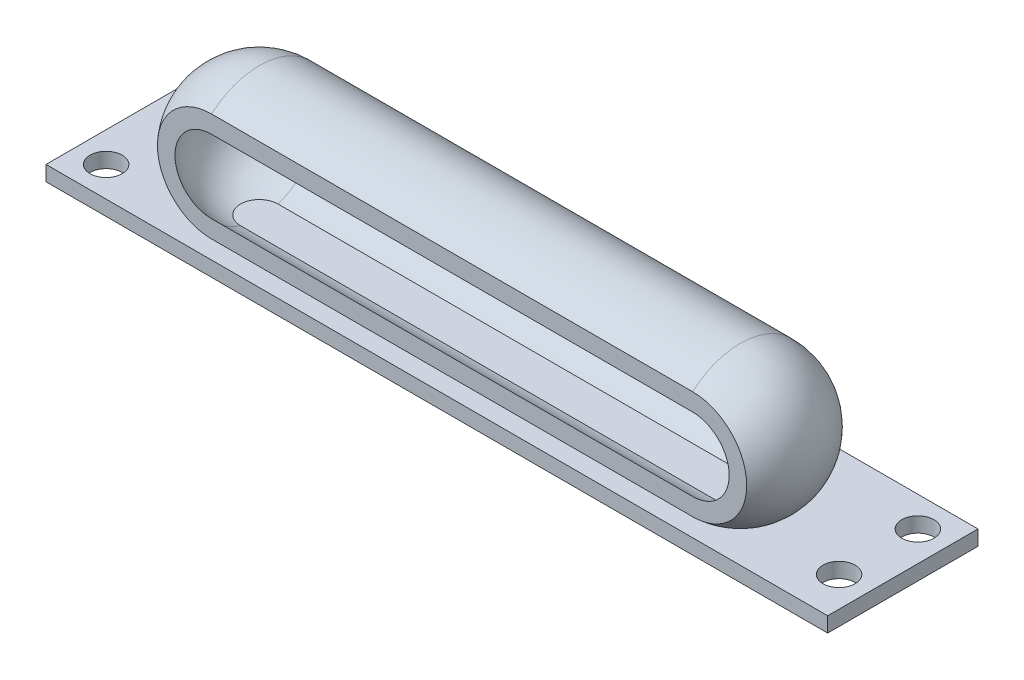
ISO-10303-21;
HEADER;
FILE_DESCRIPTION(('STEP AP214'),'2;1');
FILE_NAME('part.step','',(''),(''),'','','');
FILE_SCHEMA(('AUTOMOTIVE_DESIGN { 1 0 10303 214 1 1 1 1 }'));
ENDSEC;
DATA;
#1=APPLICATION_CONTEXT('core data for automotive mechanical design processes');
#2=APPLICATION_PROTOCOL_DEFINITION('international standard','automotive_design',2000,#1);
#3=PRODUCT_CONTEXT('',#1,'mechanical');
#4=PRODUCT('Part','Part','',(#3));
#5=PRODUCT_RELATED_PRODUCT_CATEGORY('part','',(#4));
#6=PRODUCT_DEFINITION_FORMATION('','',#4);
#7=PRODUCT_DEFINITION_CONTEXT('part definition',#1,'design');
#8=PRODUCT_DEFINITION('design','',#6,#7);
#9=PRODUCT_DEFINITION_SHAPE('','',#8);
#10=(LENGTH_UNIT() NAMED_UNIT(*) SI_UNIT(.MILLI.,.METRE.));
#11=(NAMED_UNIT(*) PLANE_ANGLE_UNIT() SI_UNIT($,.RADIAN.));
#12=(NAMED_UNIT(*) SI_UNIT($,.STERADIAN.) SOLID_ANGLE_UNIT());
#13=UNCERTAINTY_MEASURE_WITH_UNIT(LENGTH_MEASURE(1.E-05),#10,'distance_accuracy_value','');
#14=(GEOMETRIC_REPRESENTATION_CONTEXT(3) GLOBAL_UNCERTAINTY_ASSIGNED_CONTEXT((#13)) GLOBAL_UNIT_ASSIGNED_CONTEXT((#10,
#11,#12)) REPRESENTATION_CONTEXT('',''));
#15=CARTESIAN_POINT('',(0.,0.,0.));
#16=DIRECTION('',(0.,0.,1.));
#17=DIRECTION('',(1.,0.,0.));
#18=AXIS2_PLACEMENT_3D('',#15,#16,#17);
#19=CARTESIAN_POINT('',(0.,0.,0.));
#20=DIRECTION('',(-1.,0.,0.));
#21=DIRECTION('',(0.,0.,1.));
#22=AXIS2_PLACEMENT_3D('',#19,#20,#21);
#23=CYLINDRICAL_SURFACE('',#22,7.62);
#24=CARTESIAN_POINT('',(0.,0.,0.));
#25=DIRECTION('',(-1.,0.,0.));
#26=DIRECTION('',(0.,0.,1.));
#27=AXIS2_PLACEMENT_3D('',#24,#25,#26);
#28=CIRCLE('',#27,7.62);
#29=CARTESIAN_POINT('',(0.,-6.0325,4.65546385981032));
#30=VERTEX_POINT('',#29);
#31=CARTESIAN_POINT('',(0.,-5.715,5.04015624757805));
#32=VERTEX_POINT('',#31);
#33=EDGE_CURVE('E191',#30,#32,#28,.T.);
#34=ORIENTED_EDGE('',*,*,#33,.F.);
#35=DIRECTION('',(-1.,0.,0.));
#36=VECTOR('',#35,1.);
#37=CARTESIAN_POINT('',(0.,-6.0325,4.65546385981032));
#38=LINE('',#37,#36);
#39=CARTESIAN_POINT('',(50.8,-6.0325,4.65546385981032));
#40=VERTEX_POINT('',#39);
#41=EDGE_CURVE('E158',#30,#40,#38,.F.);
#42=ORIENTED_EDGE('',*,*,#41,.T.);
#43=CARTESIAN_POINT('',(50.8,0.,0.));
#44=DIRECTION('',(-1.,0.,0.));
#45=DIRECTION('',(0.,0.,1.));
#46=AXIS2_PLACEMENT_3D('',#43,#44,#45);
#47=CIRCLE('',#46,7.62);
#48=CARTESIAN_POINT('',(50.7999999999999,-5.715,5.04015624757804));
#49=VERTEX_POINT('',#48);
#50=EDGE_CURVE('E195',#40,#49,#47,.T.);
#51=ORIENTED_EDGE('',*,*,#50,.T.);
#52=DIRECTION('',(-1.,0.,0.));
#53=VECTOR('',#52,1.);
#54=CARTESIAN_POINT('',(0.,-5.715,5.04015624757805));
#55=LINE('',#54,#53);
#56=EDGE_CURVE('E199',#49,#32,#55,.T.);
#57=ORIENTED_EDGE('',*,*,#56,.T.);
#58=EDGE_LOOP('',(#34,#42,#51,#57));
#59=FACE_BOUND('',#58,.T.);
#60=ADVANCED_FACE('F33',(#59),#23,.T.);
#61=CARTESIAN_POINT('',(0.,0.,0.));
#62=DIRECTION('',(-1.,0.,0.));
#63=DIRECTION('',(0.,0.,1.));
#64=AXIS2_PLACEMENT_3D('',#61,#62,#63);
#65=CYLINDRICAL_SURFACE('',#64,6.35);
#66=DIRECTION('',(-1.,0.,0.));
#67=VECTOR('',#66,1.);
#68=CARTESIAN_POINT('',(0.,-6.0325,-1.98278686449149));
#69=LINE('',#68,#67);
#70=CARTESIAN_POINT('',(50.7999999999999,-6.0325,-1.98278686449149));
#71=VERTEX_POINT('',#70);
#72=CARTESIAN_POINT('',(0.,-6.0325,-1.98278686449149));
#73=VERTEX_POINT('',#72);
#74=EDGE_CURVE('E11',#71,#73,#69,.T.);
#75=ORIENTED_EDGE('',*,*,#74,.F.);
#76=CARTESIAN_POINT('',(50.7999999999999,0.,0.));
#77=DIRECTION('',(-1.,0.,0.));
#78=DIRECTION('',(0.,0.,1.));
#79=AXIS2_PLACEMENT_3D('',#76,#77,#78);
#80=CIRCLE('',#79,6.35);
#81=CARTESIAN_POINT('',(50.7999999999999,3.86255420673937,5.04015624757804));
#82=VERTEX_POINT('',#81);
#83=EDGE_CURVE('E172',#82,#71,#80,.T.);
#84=ORIENTED_EDGE('',*,*,#83,.F.);
#85=DIRECTION('',(-1.,0.,0.));
#86=VECTOR('',#85,1.);
#87=CARTESIAN_POINT('',(0.,3.86255420673937,5.04015624757804));
#88=LINE('',#87,#86);
#89=CARTESIAN_POINT('',(0.,3.86255420673937,5.04015624757804));
#90=VERTEX_POINT('',#89);
#91=EDGE_CURVE('E180',#90,#82,#88,.F.);
#92=ORIENTED_EDGE('',*,*,#91,.F.);
#93=CARTESIAN_POINT('',(0.,0.,0.));
#94=DIRECTION('',(-1.,0.,0.));
#95=DIRECTION('',(0.,0.,1.));
#96=AXIS2_PLACEMENT_3D('',#93,#94,#95);
#97=CIRCLE('',#96,6.35);
#98=EDGE_CURVE('E168',#90,#73,#97,.T.);
#99=ORIENTED_EDGE('',*,*,#98,.T.);
#100=EDGE_LOOP('',(#75,#84,#92,#99));
#101=FACE_BOUND('',#100,.T.);
#102=ADVANCED_FACE('F221',(#101),#65,.F.);
#103=CARTESIAN_POINT('',(0.,0.,0.));
#104=DIRECTION('',(-1.,0.,0.));
#105=DIRECTION('',(0.,1.,0.));
#106=AXIS2_PLACEMENT_3D('',#103,#104,#105);
#107=SPHERICAL_SURFACE('',#106,7.62);
#108=CARTESIAN_POINT('',(0.,5.715,5.04015624757804));
#109=VERTEX_POINT('',#108);
#110=CARTESIAN_POINT('',(0.,-6.0325,-4.65546385981032));
#111=VERTEX_POINT('',#110);
#112=EDGE_CURVE('E192',#109,#111,#28,.T.);
#113=ORIENTED_EDGE('',*,*,#112,.T.);
#114=CARTESIAN_POINT('',(0.,-6.0325,0.));
#115=DIRECTION('',(0.,1.,0.));
#116=DIRECTION('',(0.,0.,1.));
#117=AXIS2_PLACEMENT_3D('',#114,#115,#116);
#118=CIRCLE('',#117,4.65546385981032);
#119=EDGE_CURVE('E161',#111,#30,#118,.T.);
#120=ORIENTED_EDGE('',*,*,#119,.T.);
#121=ORIENTED_EDGE('',*,*,#33,.T.);
#122=CARTESIAN_POINT('',(0.,0.,5.04015624757804));
#123=DIRECTION('',(0.,0.,-1.));
#124=DIRECTION('',(-1.,0.,0.));
#125=AXIS2_PLACEMENT_3D('',#122,#123,#124);
#126=CIRCLE('',#125,5.715);
#127=EDGE_CURVE('E188',#32,#109,#126,.T.);
#128=ORIENTED_EDGE('',*,*,#127,.T.);
#129=EDGE_LOOP('',(#113,#120,#121,#128));
#130=FACE_BOUND('',#129,.T.);
#131=ADVANCED_FACE('F35',(#130),#107,.T.);
#132=CARTESIAN_POINT('',(50.8,0.,0.));
#133=DIRECTION('',(-1.,0.,0.));
#134=DIRECTION('',(0.,1.,0.));
#135=AXIS2_PLACEMENT_3D('',#132,#133,#134);
#136=SPHERICAL_SURFACE('',#135,7.62);
#137=ORIENTED_EDGE('',*,*,#50,.F.);
#138=CARTESIAN_POINT('',(50.8,-6.0325,0.));
#139=DIRECTION('',(0.,1.,0.));
#140=DIRECTION('',(0.,0.,1.));
#141=AXIS2_PLACEMENT_3D('',#138,#139,#140);
#142=CIRCLE('',#141,4.65546385981032);
#143=CARTESIAN_POINT('',(50.8,-6.0325,-4.65546385981032));
#144=VERTEX_POINT('',#143);
#145=EDGE_CURVE('E48',#40,#144,#142,.T.);
#146=ORIENTED_EDGE('',*,*,#145,.T.);
#147=CARTESIAN_POINT('',(50.7999999999999,5.715,5.04015624757804));
#148=VERTEX_POINT('',#147);
#149=EDGE_CURVE('E196',#148,#144,#47,.T.);
#150=ORIENTED_EDGE('',*,*,#149,.F.);
#151=CARTESIAN_POINT('',(50.8,0.,5.04015624757804));
#152=DIRECTION('',(0.,0.,-1.));
#153=DIRECTION('',(-1.,0.,0.));
#154=AXIS2_PLACEMENT_3D('',#151,#152,#153);
#155=CIRCLE('',#154,5.715);
#156=EDGE_CURVE('E185',#148,#49,#155,.T.);
#157=ORIENTED_EDGE('',*,*,#156,.T.);
#158=EDGE_LOOP('',(#137,#146,#150,#157));
#159=FACE_BOUND('',#158,.T.);
#160=ADVANCED_FACE('F228',(#159),#136,.T.);
#161=ORIENTED_EDGE('',*,*,#149,.T.);
#162=DIRECTION('',(-1.,0.,0.));
#163=VECTOR('',#162,1.);
#164=CARTESIAN_POINT('',(0.,-6.0325,-4.65546385981032));
#165=LINE('',#164,#163);
#166=EDGE_CURVE('E164',#144,#111,#165,.T.);
#167=ORIENTED_EDGE('',*,*,#166,.T.);
#168=ORIENTED_EDGE('',*,*,#112,.F.);
#169=DIRECTION('',(-1.,0.,0.));
#170=VECTOR('',#169,1.);
#171=CARTESIAN_POINT('',(0.,5.715,5.04015624757804));
#172=LINE('',#171,#170);
#173=EDGE_CURVE('E202',#109,#148,#172,.F.);
#174=ORIENTED_EDGE('',*,*,#173,.T.);
#175=EDGE_LOOP('',(#161,#167,#168,#174));
#176=FACE_BOUND('',#175,.T.);
#177=ADVANCED_FACE('F232',(#176),#23,.T.);
#178=CARTESIAN_POINT('',(-76.2,5.715,5.04015624757804));
#179=DIRECTION('',(0.,0.,-1.));
#180=DIRECTION('',(-1.,0.,0.));
#181=AXIS2_PLACEMENT_3D('',#178,#179,#180);
#182=PLANE('',#181);
#183=CARTESIAN_POINT('',(50.8,0.,5.04015624757804));
#184=DIRECTION('',(0.,0.,-1.));
#185=DIRECTION('',(-1.,0.,0.));
#186=AXIS2_PLACEMENT_3D('',#183,#184,#185);
#187=CIRCLE('',#186,3.86255420673937);
#188=CARTESIAN_POINT('',(50.7999999999999,-3.86255420673937,5.04015624757804));
#189=VERTEX_POINT('',#188);
#190=EDGE_CURVE('E167',#82,#189,#187,.T.);
#191=ORIENTED_EDGE('',*,*,#190,.T.);
#192=DIRECTION('',(-1.,0.,0.));
#193=VECTOR('',#192,1.);
#194=CARTESIAN_POINT('',(50.7999999999999,-3.86255420673937,5.04015624757804));
#195=LINE('',#194,#193);
#196=CARTESIAN_POINT('',(0.,-3.86255420673937,5.04015624757804));
#197=VERTEX_POINT('',#196);
#198=EDGE_CURVE('E174',#189,#197,#195,.T.);
#199=ORIENTED_EDGE('',*,*,#198,.T.);
#200=CARTESIAN_POINT('',(0.,0.,5.04015624757804));
#201=DIRECTION('',(0.,0.,-1.));
#202=DIRECTION('',(-1.,0.,0.));
#203=AXIS2_PLACEMENT_3D('',#200,#201,#202);
#204=CIRCLE('',#203,3.86255420673937);
#205=EDGE_CURVE('E175',#197,#90,#204,.T.);
#206=ORIENTED_EDGE('',*,*,#205,.T.);
#207=ORIENTED_EDGE('',*,*,#91,.T.);
#208=EDGE_LOOP('',(#191,#199,#206,#207));
#209=FACE_BOUND('',#208,.T.);
#210=ORIENTED_EDGE('',*,*,#56,.F.);
#211=ORIENTED_EDGE('',*,*,#156,.F.);
#212=ORIENTED_EDGE('',*,*,#173,.F.);
#213=ORIENTED_EDGE('',*,*,#127,.F.);
#214=EDGE_LOOP('',(#210,#211,#212,#213));
#215=FACE_BOUND('',#214,.T.);
#216=ADVANCED_FACE('F217',(#209,#215),#182,.F.);
#217=CARTESIAN_POINT('',(0.,0.,0.));
#218=DIRECTION('',(-1.,0.,0.));
#219=DIRECTION('',(0.,1.,0.));
#220=AXIS2_PLACEMENT_3D('',#217,#218,#219);
#221=SPHERICAL_SURFACE('',#220,6.35);
#222=CARTESIAN_POINT('',(0.,-6.0325,0.));
#223=DIRECTION('',(0.,1.,0.));
#224=DIRECTION('',(0.,0.,1.));
#225=AXIS2_PLACEMENT_3D('',#222,#223,#224);
#226=CIRCLE('',#225,1.98278686449149);
#227=CARTESIAN_POINT('',(0.,-6.0325,1.98278686449149));
#228=VERTEX_POINT('',#227);
#229=EDGE_CURVE('E150',#73,#228,#226,.T.);
#230=ORIENTED_EDGE('',*,*,#229,.F.);
#231=ORIENTED_EDGE('',*,*,#98,.F.);
#232=ORIENTED_EDGE('',*,*,#205,.F.);
#233=EDGE_CURVE('E171',#228,#197,#97,.T.);
#234=ORIENTED_EDGE('',*,*,#233,.F.);
#235=EDGE_LOOP('',(#230,#231,#232,#234));
#236=FACE_BOUND('',#235,.T.);
#237=ADVANCED_FACE('F214',(#236),#221,.F.);
#238=CARTESIAN_POINT('',(50.8,0.,0.));
#239=DIRECTION('',(-1.,0.,0.));
#240=DIRECTION('',(0.,1.,0.));
#241=AXIS2_PLACEMENT_3D('',#238,#239,#240);
#242=SPHERICAL_SURFACE('',#241,6.35);
#243=CARTESIAN_POINT('',(50.8,-6.0325,0.));
#244=DIRECTION('',(0.,1.,0.));
#245=DIRECTION('',(0.,0.,1.));
#246=AXIS2_PLACEMENT_3D('',#243,#244,#245);
#247=CIRCLE('',#246,1.98278686449149);
#248=CARTESIAN_POINT('',(50.7999999999999,-6.0325,1.98278686449149));
#249=VERTEX_POINT('',#248);
#250=EDGE_CURVE('E147',#249,#71,#247,.T.);
#251=ORIENTED_EDGE('',*,*,#250,.F.);
#252=EDGE_CURVE('E170',#249,#189,#80,.T.);
#253=ORIENTED_EDGE('',*,*,#252,.T.);
#254=ORIENTED_EDGE('',*,*,#190,.F.);
#255=ORIENTED_EDGE('',*,*,#83,.T.);
#256=EDGE_LOOP('',(#251,#253,#254,#255));
#257=FACE_BOUND('',#256,.T.);
#258=ADVANCED_FACE('F220',(#257),#242,.F.);
#259=DIRECTION('',(-1.,0.,0.));
#260=VECTOR('',#259,1.);
#261=CARTESIAN_POINT('',(0.,-6.0325,1.98278686449149));
#262=LINE('',#261,#260);
#263=EDGE_CURVE('E41',#228,#249,#262,.F.);
#264=ORIENTED_EDGE('',*,*,#263,.F.);
#265=ORIENTED_EDGE('',*,*,#233,.T.);
#266=ORIENTED_EDGE('',*,*,#198,.F.);
#267=ORIENTED_EDGE('',*,*,#252,.F.);
#268=EDGE_LOOP('',(#264,#265,#266,#267));
#269=FACE_BOUND('',#268,.T.);
#270=ADVANCED_FACE('F210',(#269),#65,.F.);
#271=CARTESIAN_POINT('',(0.,-6.0325,0.));
#272=DIRECTION('',(0.,1.,0.));
#273=DIRECTION('',(0.,0.,1.));
#274=AXIS2_PLACEMENT_3D('',#271,#272,#273);
#275=PLANE('',#274);
#276=ORIENTED_EDGE('',*,*,#250,.T.);
#277=ORIENTED_EDGE('',*,*,#74,.T.);
#278=ORIENTED_EDGE('',*,*,#229,.T.);
#279=ORIENTED_EDGE('',*,*,#263,.T.);
#280=EDGE_LOOP('',(#276,#277,#278,#279));
#281=FACE_BOUND('',#280,.T.);
#282=ADVANCED_FACE('F206',(#281),#275,.T.);
#283=CARTESIAN_POINT('',(-12.7,-6.0325,-6.05242187621098));
#284=DIRECTION('',(0.,1.,0.));
#285=DIRECTION('',(0.,0.,1.));
#286=AXIS2_PLACEMENT_3D('',#283,#284,#285);
#287=CIRCLE('',#286,1.69999999999999);
#288=CARTESIAN_POINT('',(-12.7,-6.0325,-4.35242187621099));
#289=VERTEX_POINT('',#288);
#290=EDGE_CURVE('E285',#289,#289,#287,.T.);
#291=ORIENTED_EDGE('',*,*,#290,.F.);
#292=EDGE_LOOP('',(#291));
#293=FACE_BOUND('',#292,.T.);
#294=CARTESIAN_POINT('',(-12.7,-6.0325,3.47257812378903));
#295=DIRECTION('',(0.,1.,0.));
#296=DIRECTION('',(0.,0.,1.));
#297=AXIS2_PLACEMENT_3D('',#294,#295,#296);
#298=CIRCLE('',#297,1.69999999999999);
#299=CARTESIAN_POINT('',(-12.7,-6.0325,5.17257812378902));
#300=VERTEX_POINT('',#299);
#301=EDGE_CURVE('E288',#300,#300,#298,.T.);
#302=ORIENTED_EDGE('',*,*,#301,.F.);
#303=EDGE_LOOP('',(#302));
#304=FACE_BOUND('',#303,.T.);
#305=CARTESIAN_POINT('',(63.5,-6.0325,-6.05242187621098));
#306=DIRECTION('',(0.,1.,0.));
#307=DIRECTION('',(0.,0.,1.));
#308=AXIS2_PLACEMENT_3D('',#305,#306,#307);
#309=CIRCLE('',#308,1.69999999999999);
#310=CARTESIAN_POINT('',(63.5,-6.0325,-4.35242187621099));
#311=VERTEX_POINT('',#310);
#312=EDGE_CURVE('E296',#311,#311,#309,.T.);
#313=ORIENTED_EDGE('',*,*,#312,.F.);
#314=EDGE_LOOP('',(#313));
#315=FACE_BOUND('',#314,.T.);
#316=CARTESIAN_POINT('',(63.5,-6.0325,2.26916828969183));
#317=DIRECTION('',(0.,1.,0.));
#318=DIRECTION('',(0.,0.,1.));
#319=AXIS2_PLACEMENT_3D('',#316,#317,#318);
#320=CIRCLE('',#319,1.69999999999999);
#321=CARTESIAN_POINT('',(63.5,-6.0325,3.96916828969182));
#322=VERTEX_POINT('',#321);
#323=EDGE_CURVE('E302',#322,#322,#320,.T.);
#324=ORIENTED_EDGE('',*,*,#323,.F.);
#325=EDGE_LOOP('',(#324));
#326=FACE_BOUND('',#325,.T.);
#327=DIRECTION('',(0.,0.,1.));
#328=VECTOR('',#327,1.);
#329=CARTESIAN_POINT('',(-15.875,-6.0325,-9.22742187621097));
#330=LINE('',#329,#328);
#331=CARTESIAN_POINT('',(-15.875,-6.0325,-9.22742187621097));
#332=VERTEX_POINT('',#331);
#333=CARTESIAN_POINT('',(-15.875,-6.0325,6.64757812378903));
#334=VERTEX_POINT('',#333);
#335=EDGE_CURVE('E133',#332,#334,#330,.T.);
#336=ORIENTED_EDGE('',*,*,#335,.T.);
#337=DIRECTION('',(1.,0.,0.));
#338=VECTOR('',#337,1.);
#339=CARTESIAN_POINT('',(-15.875,-6.0325,6.64757812378903));
#340=LINE('',#339,#338);
#341=CARTESIAN_POINT('',(66.675,-6.0325,6.64757812378902));
#342=VERTEX_POINT('',#341);
#343=EDGE_CURVE('E122',#334,#342,#340,.T.);
#344=ORIENTED_EDGE('',*,*,#343,.T.);
#345=DIRECTION('',(0.,0.,-1.));
#346=VECTOR('',#345,1.);
#347=CARTESIAN_POINT('',(66.675,-6.0325,-9.22742187621098));
#348=LINE('',#347,#346);
#349=CARTESIAN_POINT('',(66.675,-6.0325,-9.22742187621098));
#350=VERTEX_POINT('',#349);
#351=EDGE_CURVE('E132',#342,#350,#348,.T.);
#352=ORIENTED_EDGE('',*,*,#351,.T.);
#353=DIRECTION('',(-1.,0.,0.));
#354=VECTOR('',#353,1.);
#355=CARTESIAN_POINT('',(-15.875,-6.0325,-9.22742187621097));
#356=LINE('',#355,#354);
#357=EDGE_CURVE('E138',#350,#332,#356,.T.);
#358=ORIENTED_EDGE('',*,*,#357,.T.);
#359=EDGE_LOOP('',(#336,#344,#352,#358));
#360=FACE_BOUND('',#359,.T.);
#361=ORIENTED_EDGE('',*,*,#166,.F.);
#362=ORIENTED_EDGE('',*,*,#145,.F.);
#363=ORIENTED_EDGE('',*,*,#41,.F.);
#364=ORIENTED_EDGE('',*,*,#119,.F.);
#365=EDGE_LOOP('',(#361,#362,#363,#364));
#366=FACE_BOUND('',#365,.T.);
#367=ADVANCED_FACE('F136',(#293,#304,#315,#326,#360,#366),#275,.T.);
#368=CARTESIAN_POINT('',(-15.875,-6.0325,-9.22742187621097));
#369=DIRECTION('',(1.,0.,0.));
#370=DIRECTION('',(0.,0.,-1.));
#371=AXIS2_PLACEMENT_3D('',#368,#369,#370);
#372=PLANE('',#371);
#373=DIRECTION('',(0.,0.,1.));
#374=VECTOR('',#373,1.);
#375=CARTESIAN_POINT('',(-15.875,-7.62,-9.22742187621097));
#376=LINE('',#375,#374);
#377=CARTESIAN_POINT('',(-15.875,-7.62,-9.22742187621097));
#378=VERTEX_POINT('',#377);
#379=CARTESIAN_POINT('',(-15.875,-7.62,6.64757812378903));
#380=VERTEX_POINT('',#379);
#381=EDGE_CURVE('E146',#378,#380,#376,.T.);
#382=ORIENTED_EDGE('',*,*,#381,.T.);
#383=DIRECTION('',(0.,-1.,0.));
#384=VECTOR('',#383,1.);
#385=CARTESIAN_POINT('',(-15.875,-6.0325,6.64757812378903));
#386=LINE('',#385,#384);
#387=EDGE_CURVE('E126',#334,#380,#386,.T.);
#388=ORIENTED_EDGE('',*,*,#387,.F.);
#389=ORIENTED_EDGE('',*,*,#335,.F.);
#390=DIRECTION('',(0.,-1.,0.));
#391=VECTOR('',#390,1.);
#392=CARTESIAN_POINT('',(-15.875,-6.0325,-9.22742187621097));
#393=LINE('',#392,#391);
#394=EDGE_CURVE('E310',#332,#378,#393,.T.);
#395=ORIENTED_EDGE('',*,*,#394,.T.);
#396=EDGE_LOOP('',(#382,#388,#389,#395));
#397=FACE_BOUND('',#396,.T.);
#398=ADVANCED_FACE('F144',(#397),#372,.F.);
#399=CARTESIAN_POINT('',(-15.875,-6.0325,6.64757812378903));
#400=DIRECTION('',(0.,0.,-1.));
#401=DIRECTION('',(-1.,0.,0.));
#402=AXIS2_PLACEMENT_3D('',#399,#400,#401);
#403=PLANE('',#402);
#404=DIRECTION('',(1.,0.,0.));
#405=VECTOR('',#404,1.);
#406=CARTESIAN_POINT('',(-15.875,-7.62,6.64757812378903));
#407=LINE('',#406,#405);
#408=CARTESIAN_POINT('',(66.675,-7.62,6.64757812378902));
#409=VERTEX_POINT('',#408);
#410=EDGE_CURVE('E312',#380,#409,#407,.T.);
#411=ORIENTED_EDGE('',*,*,#410,.T.);
#412=DIRECTION('',(0.,-1.,0.));
#413=VECTOR('',#412,1.);
#414=CARTESIAN_POINT('',(66.675,-6.0325,6.64757812378902));
#415=LINE('',#414,#413);
#416=EDGE_CURVE('E129',#342,#409,#415,.T.);
#417=ORIENTED_EDGE('',*,*,#416,.F.);
#418=ORIENTED_EDGE('',*,*,#343,.F.);
#419=ORIENTED_EDGE('',*,*,#387,.T.);
#420=EDGE_LOOP('',(#411,#417,#418,#419));
#421=FACE_BOUND('',#420,.T.);
#422=ADVANCED_FACE('F124',(#421),#403,.F.);
#423=CARTESIAN_POINT('',(66.675,-6.0325,-9.22742187621098));
#424=DIRECTION('',(-1.,0.,0.));
#425=DIRECTION('',(0.,0.,1.));
#426=AXIS2_PLACEMENT_3D('',#423,#424,#425);
#427=PLANE('',#426);
#428=DIRECTION('',(0.,0.,-1.));
#429=VECTOR('',#428,1.);
#430=CARTESIAN_POINT('',(66.675,-7.62,-9.22742187621098));
#431=LINE('',#430,#429);
#432=CARTESIAN_POINT('',(66.675,-7.62,-9.22742187621098));
#433=VERTEX_POINT('',#432);
#434=EDGE_CURVE('E314',#409,#433,#431,.T.);
#435=ORIENTED_EDGE('',*,*,#434,.T.);
#436=DIRECTION('',(0.,-1.,0.));
#437=VECTOR('',#436,1.);
#438=CARTESIAN_POINT('',(66.675,-6.0325,-9.22742187621098));
#439=LINE('',#438,#437);
#440=EDGE_CURVE('E152',#350,#433,#439,.T.);
#441=ORIENTED_EDGE('',*,*,#440,.F.);
#442=ORIENTED_EDGE('',*,*,#351,.F.);
#443=ORIENTED_EDGE('',*,*,#416,.T.);
#444=EDGE_LOOP('',(#435,#441,#442,#443));
#445=FACE_BOUND('',#444,.T.);
#446=ADVANCED_FACE('F250',(#445),#427,.F.);
#447=CARTESIAN_POINT('',(-15.875,-6.0325,-9.22742187621097));
#448=DIRECTION('',(0.,0.,1.));
#449=DIRECTION('',(1.,0.,0.));
#450=AXIS2_PLACEMENT_3D('',#447,#448,#449);
#451=PLANE('',#450);
#452=DIRECTION('',(-1.,0.,0.));
#453=VECTOR('',#452,1.);
#454=CARTESIAN_POINT('',(-15.875,-7.62,-9.22742187621097));
#455=LINE('',#454,#453);
#456=EDGE_CURVE('E142',#433,#378,#455,.T.);
#457=ORIENTED_EDGE('',*,*,#456,.T.);
#458=ORIENTED_EDGE('',*,*,#394,.F.);
#459=ORIENTED_EDGE('',*,*,#357,.F.);
#460=ORIENTED_EDGE('',*,*,#440,.T.);
#461=EDGE_LOOP('',(#457,#458,#459,#460));
#462=FACE_BOUND('',#461,.T.);
#463=ADVANCED_FACE('F253',(#462),#451,.F.);
#464=CARTESIAN_POINT('',(0.,-7.62,0.));
#465=DIRECTION('',(0.,1.,0.));
#466=DIRECTION('',(0.,0.,1.));
#467=AXIS2_PLACEMENT_3D('',#464,#465,#466);
#468=PLANE('',#467);
#469=CARTESIAN_POINT('',(-12.7,-7.62,-6.05242187621098));
#470=DIRECTION('',(0.,1.,0.));
#471=DIRECTION('',(0.,0.,1.));
#472=AXIS2_PLACEMENT_3D('',#469,#470,#471);
#473=CIRCLE('',#472,1.7);
#474=CARTESIAN_POINT('',(-12.7,-7.62,-4.35242187621098));
#475=VERTEX_POINT('',#474);
#476=EDGE_CURVE('E282',#475,#475,#473,.T.);
#477=ORIENTED_EDGE('',*,*,#476,.T.);
#478=EDGE_LOOP('',(#477));
#479=FACE_BOUND('',#478,.T.);
#480=CARTESIAN_POINT('',(-12.7,-7.62,3.47257812378903));
#481=DIRECTION('',(0.,1.,0.));
#482=DIRECTION('',(0.,0.,1.));
#483=AXIS2_PLACEMENT_3D('',#480,#481,#482);
#484=CIRCLE('',#483,1.7);
#485=CARTESIAN_POINT('',(-12.7,-7.62,5.17257812378903));
#486=VERTEX_POINT('',#485);
#487=EDGE_CURVE('E293',#486,#486,#484,.T.);
#488=ORIENTED_EDGE('',*,*,#487,.T.);
#489=EDGE_LOOP('',(#488));
#490=FACE_BOUND('',#489,.T.);
#491=CARTESIAN_POINT('',(63.5,-7.62,-6.05242187621098));
#492=DIRECTION('',(0.,1.,0.));
#493=DIRECTION('',(0.,0.,1.));
#494=AXIS2_PLACEMENT_3D('',#491,#492,#493);
#495=CIRCLE('',#494,1.69999999999999);
#496=CARTESIAN_POINT('',(63.5,-7.62,-4.35242187621099));
#497=VERTEX_POINT('',#496);
#498=EDGE_CURVE('E299',#497,#497,#495,.T.);
#499=ORIENTED_EDGE('',*,*,#498,.T.);
#500=EDGE_LOOP('',(#499));
#501=FACE_BOUND('',#500,.T.);
#502=CARTESIAN_POINT('',(63.5,-7.62,2.26916828969183));
#503=DIRECTION('',(0.,1.,0.));
#504=DIRECTION('',(0.,0.,1.));
#505=AXIS2_PLACEMENT_3D('',#502,#503,#504);
#506=CIRCLE('',#505,1.69999999999999);
#507=CARTESIAN_POINT('',(63.5,-7.62,3.96916828969182));
#508=VERTEX_POINT('',#507);
#509=EDGE_CURVE('E305',#508,#508,#506,.T.);
#510=ORIENTED_EDGE('',*,*,#509,.T.);
#511=EDGE_LOOP('',(#510));
#512=FACE_BOUND('',#511,.T.);
#513=ORIENTED_EDGE('',*,*,#381,.F.);
#514=ORIENTED_EDGE('',*,*,#456,.F.);
#515=ORIENTED_EDGE('',*,*,#434,.F.);
#516=ORIENTED_EDGE('',*,*,#410,.F.);
#517=EDGE_LOOP('',(#513,#514,#515,#516));
#518=FACE_BOUND('',#517,.T.);
#519=ADVANCED_FACE('F257',(#479,#490,#501,#512,#518),#468,.F.);
#520=CARTESIAN_POINT('',(63.5,-6.0325,2.26916828969183));
#521=DIRECTION('',(0.,1.,0.));
#522=DIRECTION('',(0.,0.,1.));
#523=AXIS2_PLACEMENT_3D('',#520,#521,#522);
#524=CYLINDRICAL_SURFACE('',#523,1.69999999999999);
#525=ORIENTED_EDGE('',*,*,#509,.F.);
#526=EDGE_LOOP('',(#525));
#527=FACE_BOUND('',#526,.T.);
#528=ORIENTED_EDGE('',*,*,#323,.T.);
#529=EDGE_LOOP('',(#528));
#530=FACE_BOUND('',#529,.T.);
#531=ADVANCED_FACE('F260',(#527,#530),#524,.F.);
#532=CARTESIAN_POINT('',(63.5,-6.0325,-6.05242187621098));
#533=DIRECTION('',(0.,1.,0.));
#534=DIRECTION('',(0.,0.,1.));
#535=AXIS2_PLACEMENT_3D('',#532,#533,#534);
#536=CYLINDRICAL_SURFACE('',#535,1.69999999999999);
#537=ORIENTED_EDGE('',*,*,#498,.F.);
#538=EDGE_LOOP('',(#537));
#539=FACE_BOUND('',#538,.T.);
#540=ORIENTED_EDGE('',*,*,#312,.T.);
#541=EDGE_LOOP('',(#540));
#542=FACE_BOUND('',#541,.T.);
#543=ADVANCED_FACE('F265',(#539,#542),#536,.F.);
#544=CARTESIAN_POINT('',(-12.7,-6.0325,3.47257812378903));
#545=DIRECTION('',(0.,1.,0.));
#546=DIRECTION('',(0.,0.,1.));
#547=AXIS2_PLACEMENT_3D('',#544,#545,#546);
#548=CYLINDRICAL_SURFACE('',#547,1.69999999999999);
#549=ORIENTED_EDGE('',*,*,#487,.F.);
#550=EDGE_LOOP('',(#549));
#551=FACE_BOUND('',#550,.T.);
#552=ORIENTED_EDGE('',*,*,#301,.T.);
#553=EDGE_LOOP('',(#552));
#554=FACE_BOUND('',#553,.T.);
#555=ADVANCED_FACE('F269',(#551,#554),#548,.F.);
#556=CARTESIAN_POINT('',(-12.7,-6.0325,-6.05242187621098));
#557=DIRECTION('',(0.,1.,0.));
#558=DIRECTION('',(0.,0.,1.));
#559=AXIS2_PLACEMENT_3D('',#556,#557,#558);
#560=CYLINDRICAL_SURFACE('',#559,1.69999999999999);
#561=ORIENTED_EDGE('',*,*,#476,.F.);
#562=EDGE_LOOP('',(#561));
#563=FACE_BOUND('',#562,.T.);
#564=ORIENTED_EDGE('',*,*,#290,.T.);
#565=EDGE_LOOP('',(#564));
#566=FACE_BOUND('',#565,.T.);
#567=ADVANCED_FACE('F273',(#563,#566),#560,.F.);
#568=CLOSED_SHELL('',(#60,#102,#131,#160,#177,#216,#237,#258,#270,#282,#367,#398,#422,#446,#463,
#519,#531,#543,#555,#567));
#569=MANIFOLD_SOLID_BREP('B2',#568);
#570=ADVANCED_BREP_SHAPE_REPRESENTATION('',(#18,#569),#14);
#571=SHAPE_DEFINITION_REPRESENTATION(#9,#570);
ENDSEC;
END-ISO-10303-21;
